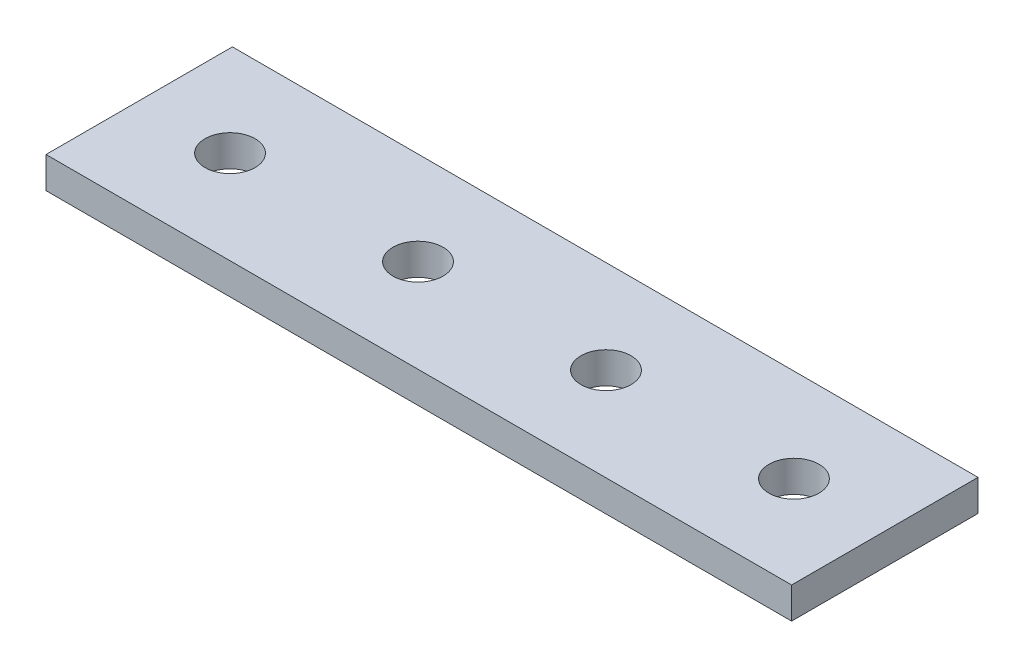
ISO-10303-21;
HEADER;
FILE_DESCRIPTION(('STEP AP214'),'2;1');
FILE_NAME('part.step','',(''),(''),'','','');
FILE_SCHEMA(('AUTOMOTIVE_DESIGN { 1 0 10303 214 1 1 1 1 }'));
ENDSEC;
DATA;
#1=APPLICATION_CONTEXT('core data for automotive mechanical design processes');
#2=APPLICATION_PROTOCOL_DEFINITION('international standard','automotive_design',2000,#1);
#3=PRODUCT_CONTEXT('',#1,'mechanical');
#4=PRODUCT('Part','Part','',(#3));
#5=PRODUCT_RELATED_PRODUCT_CATEGORY('part','',(#4));
#6=PRODUCT_DEFINITION_FORMATION('','',#4);
#7=PRODUCT_DEFINITION_CONTEXT('part definition',#1,'design');
#8=PRODUCT_DEFINITION('design','',#6,#7);
#9=PRODUCT_DEFINITION_SHAPE('','',#8);
#10=(LENGTH_UNIT() NAMED_UNIT(*) SI_UNIT(.MILLI.,.METRE.));
#11=(NAMED_UNIT(*) PLANE_ANGLE_UNIT() SI_UNIT($,.RADIAN.));
#12=(NAMED_UNIT(*) SI_UNIT($,.STERADIAN.) SOLID_ANGLE_UNIT());
#13=UNCERTAINTY_MEASURE_WITH_UNIT(LENGTH_MEASURE(1.E-05),#10,'distance_accuracy_value','');
#14=(GEOMETRIC_REPRESENTATION_CONTEXT(3) GLOBAL_UNCERTAINTY_ASSIGNED_CONTEXT((#13)) GLOBAL_UNIT_ASSIGNED_CONTEXT((#10,
#11,#12)) REPRESENTATION_CONTEXT('',''));
#15=CARTESIAN_POINT('',(0.,0.,0.));
#16=DIRECTION('',(0.,0.,1.));
#17=DIRECTION('',(1.,0.,0.));
#18=AXIS2_PLACEMENT_3D('',#15,#16,#17);
#19=CARTESIAN_POINT('',(47.8,2.,0.));
#20=DIRECTION('',(1.,0.,0.));
#21=DIRECTION('',(0.,0.,-1.));
#22=AXIS2_PLACEMENT_3D('',#19,#20,#21);
#23=PLANE('',#22);
#24=DIRECTION('',(0.,0.,1.));
#25=VECTOR('',#24,1.);
#26=CARTESIAN_POINT('',(47.8,0.,0.));
#27=LINE('',#26,#25);
#28=CARTESIAN_POINT('',(47.8,0.,-11.9));
#29=VERTEX_POINT('',#28);
#30=CARTESIAN_POINT('',(47.8,0.,0.));
#31=VERTEX_POINT('',#30);
#32=EDGE_CURVE('E108',#29,#31,#27,.T.);
#33=ORIENTED_EDGE('',*,*,#32,.F.);
#34=DIRECTION('',(0.,-1.,0.));
#35=VECTOR('',#34,1.);
#36=CARTESIAN_POINT('',(47.8,2.,-11.9));
#37=LINE('',#36,#35);
#38=CARTESIAN_POINT('',(47.8,2.,-11.9));
#39=VERTEX_POINT('',#38);
#40=EDGE_CURVE('E11',#39,#29,#37,.T.);
#41=ORIENTED_EDGE('',*,*,#40,.F.);
#42=DIRECTION('',(0.,0.,1.));
#43=VECTOR('',#42,1.);
#44=CARTESIAN_POINT('',(47.8,2.,0.));
#45=LINE('',#44,#43);
#46=CARTESIAN_POINT('',(47.8,2.,0.));
#47=VERTEX_POINT('',#46);
#48=EDGE_CURVE('E101',#39,#47,#45,.T.);
#49=ORIENTED_EDGE('',*,*,#48,.T.);
#50=DIRECTION('',(0.,-1.,0.));
#51=VECTOR('',#50,1.);
#52=CARTESIAN_POINT('',(47.8,2.,0.));
#53=LINE('',#52,#51);
#54=EDGE_CURVE('E81',#47,#31,#53,.T.);
#55=ORIENTED_EDGE('',*,*,#54,.T.);
#56=EDGE_LOOP('',(#33,#41,#49,#55));
#57=FACE_BOUND('',#56,.T.);
#58=ADVANCED_FACE('F41',(#57),#23,.T.);
#59=CARTESIAN_POINT('',(0.,2.,-11.9));
#60=DIRECTION('',(0.,0.,-1.));
#61=DIRECTION('',(-1.,0.,0.));
#62=AXIS2_PLACEMENT_3D('',#59,#60,#61);
#63=PLANE('',#62);
#64=DIRECTION('',(1.,0.,0.));
#65=VECTOR('',#64,1.);
#66=CARTESIAN_POINT('',(0.,0.,-11.9));
#67=LINE('',#66,#65);
#68=CARTESIAN_POINT('',(0.200000000000001,0.,-11.9));
#69=VERTEX_POINT('',#68);
#70=EDGE_CURVE('E94',#69,#29,#67,.T.);
#71=ORIENTED_EDGE('',*,*,#70,.F.);
#72=DIRECTION('',(0.,-1.,0.));
#73=VECTOR('',#72,1.);
#74=CARTESIAN_POINT('',(0.200000000000001,2.,-11.9));
#75=LINE('',#74,#73);
#76=CARTESIAN_POINT('',(0.200000000000001,2.,-11.9));
#77=VERTEX_POINT('',#76);
#78=EDGE_CURVE('E50',#77,#69,#75,.T.);
#79=ORIENTED_EDGE('',*,*,#78,.F.);
#80=DIRECTION('',(1.,0.,0.));
#81=VECTOR('',#80,1.);
#82=CARTESIAN_POINT('',(0.,2.,-11.9));
#83=LINE('',#82,#81);
#84=EDGE_CURVE('E92',#77,#39,#83,.T.);
#85=ORIENTED_EDGE('',*,*,#84,.T.);
#86=ORIENTED_EDGE('',*,*,#40,.T.);
#87=EDGE_LOOP('',(#71,#79,#85,#86));
#88=FACE_BOUND('',#87,.T.);
#89=ADVANCED_FACE('F90',(#88),#63,.T.);
#90=CARTESIAN_POINT('',(0.200000000000001,2.,0.));
#91=DIRECTION('',(1.,0.,0.));
#92=DIRECTION('',(0.,0.,-1.));
#93=AXIS2_PLACEMENT_3D('',#90,#91,#92);
#94=PLANE('',#93);
#95=DIRECTION('',(0.,0.,1.));
#96=VECTOR('',#95,1.);
#97=CARTESIAN_POINT('',(0.200000000000001,0.,0.));
#98=LINE('',#97,#96);
#99=CARTESIAN_POINT('',(0.200000000000001,0.,0.));
#100=VERTEX_POINT('',#99);
#101=EDGE_CURVE('E74',#69,#100,#98,.T.);
#102=ORIENTED_EDGE('',*,*,#101,.T.);
#103=DIRECTION('',(0.,-1.,0.));
#104=VECTOR('',#103,1.);
#105=CARTESIAN_POINT('',(0.200000000000001,2.,0.));
#106=LINE('',#105,#104);
#107=CARTESIAN_POINT('',(0.200000000000001,2.,0.));
#108=VERTEX_POINT('',#107);
#109=EDGE_CURVE('E95',#108,#100,#106,.T.);
#110=ORIENTED_EDGE('',*,*,#109,.F.);
#111=DIRECTION('',(0.,0.,1.));
#112=VECTOR('',#111,1.);
#113=CARTESIAN_POINT('',(0.200000000000001,2.,0.));
#114=LINE('',#113,#112);
#115=EDGE_CURVE('E97',#77,#108,#114,.T.);
#116=ORIENTED_EDGE('',*,*,#115,.F.);
#117=ORIENTED_EDGE('',*,*,#78,.T.);
#118=EDGE_LOOP('',(#102,#110,#116,#117));
#119=FACE_BOUND('',#118,.T.);
#120=ADVANCED_FACE('F98',(#119),#94,.F.);
#121=CARTESIAN_POINT('',(0.,2.,0.));
#122=DIRECTION('',(0.,0.,-1.));
#123=DIRECTION('',(-1.,0.,0.));
#124=AXIS2_PLACEMENT_3D('',#121,#122,#123);
#125=PLANE('',#124);
#126=DIRECTION('',(1.,0.,0.));
#127=VECTOR('',#126,1.);
#128=CARTESIAN_POINT('',(0.,0.,0.));
#129=LINE('',#128,#127);
#130=EDGE_CURVE('E103',#100,#31,#129,.T.);
#131=ORIENTED_EDGE('',*,*,#130,.T.);
#132=ORIENTED_EDGE('',*,*,#54,.F.);
#133=DIRECTION('',(1.,0.,0.));
#134=VECTOR('',#133,1.);
#135=CARTESIAN_POINT('',(0.,2.,0.));
#136=LINE('',#135,#134);
#137=EDGE_CURVE('E59',#108,#47,#136,.T.);
#138=ORIENTED_EDGE('',*,*,#137,.F.);
#139=ORIENTED_EDGE('',*,*,#109,.T.);
#140=EDGE_LOOP('',(#131,#132,#138,#139));
#141=FACE_BOUND('',#140,.T.);
#142=ADVANCED_FACE('F164',(#141),#125,.F.);
#143=CARTESIAN_POINT('',(0.,2.,0.));
#144=DIRECTION('',(0.,1.,0.));
#145=DIRECTION('',(0.,0.,1.));
#146=AXIS2_PLACEMENT_3D('',#143,#144,#145);
#147=PLANE('',#146);
#148=CARTESIAN_POINT('',(42.,2.,-5.95));
#149=DIRECTION('',(0.,1.,0.));
#150=DIRECTION('',(0.,0.,1.));
#151=AXIS2_PLACEMENT_3D('',#148,#149,#150);
#152=CIRCLE('',#151,1.6);
#153=CARTESIAN_POINT('',(42.,2.,-4.35));
#154=VERTEX_POINT('',#153);
#155=EDGE_CURVE('E133',#154,#154,#152,.T.);
#156=ORIENTED_EDGE('',*,*,#155,.F.);
#157=EDGE_LOOP('',(#156));
#158=FACE_BOUND('',#157,.T.);
#159=CARTESIAN_POINT('',(30.,2.,-5.95));
#160=DIRECTION('',(0.,1.,0.));
#161=DIRECTION('',(0.,0.,1.));
#162=AXIS2_PLACEMENT_3D('',#159,#160,#161);
#163=CIRCLE('',#162,1.6);
#164=CARTESIAN_POINT('',(30.,2.,-4.35));
#165=VERTEX_POINT('',#164);
#166=EDGE_CURVE('E123',#165,#165,#163,.T.);
#167=ORIENTED_EDGE('',*,*,#166,.F.);
#168=EDGE_LOOP('',(#167));
#169=FACE_BOUND('',#168,.T.);
#170=CARTESIAN_POINT('',(18.,2.,-5.95));
#171=DIRECTION('',(0.,1.,0.));
#172=DIRECTION('',(0.,0.,1.));
#173=AXIS2_PLACEMENT_3D('',#170,#171,#172);
#174=CIRCLE('',#173,1.6);
#175=CARTESIAN_POINT('',(18.,2.,-4.35));
#176=VERTEX_POINT('',#175);
#177=EDGE_CURVE('E120',#176,#176,#174,.T.);
#178=ORIENTED_EDGE('',*,*,#177,.F.);
#179=EDGE_LOOP('',(#178));
#180=FACE_BOUND('',#179,.T.);
#181=CARTESIAN_POINT('',(6.,2.,-5.95));
#182=DIRECTION('',(0.,1.,0.));
#183=DIRECTION('',(0.,0.,1.));
#184=AXIS2_PLACEMENT_3D('',#181,#182,#183);
#185=CIRCLE('',#184,1.6);
#186=CARTESIAN_POINT('',(6.,2.,-4.35));
#187=VERTEX_POINT('',#186);
#188=EDGE_CURVE('E119',#187,#187,#185,.T.);
#189=ORIENTED_EDGE('',*,*,#188,.F.);
#190=EDGE_LOOP('',(#189));
#191=FACE_BOUND('',#190,.T.);
#192=ORIENTED_EDGE('',*,*,#48,.F.);
#193=ORIENTED_EDGE('',*,*,#84,.F.);
#194=ORIENTED_EDGE('',*,*,#115,.T.);
#195=ORIENTED_EDGE('',*,*,#137,.T.);
#196=EDGE_LOOP('',(#192,#193,#194,#195));
#197=FACE_BOUND('',#196,.T.);
#198=ADVANCED_FACE('F100',(#158,#169,#180,#191,#197),#147,.T.);
#199=CARTESIAN_POINT('',(0.,0.,0.));
#200=DIRECTION('',(0.,1.,0.));
#201=DIRECTION('',(0.,0.,1.));
#202=AXIS2_PLACEMENT_3D('',#199,#200,#201);
#203=PLANE('',#202);
#204=CARTESIAN_POINT('',(42.,0.,-5.95));
#205=DIRECTION('',(0.,1.,0.));
#206=DIRECTION('',(0.,0.,1.));
#207=AXIS2_PLACEMENT_3D('',#204,#205,#206);
#208=CIRCLE('',#207,1.6);
#209=CARTESIAN_POINT('',(42.,0.,-4.35));
#210=VERTEX_POINT('',#209);
#211=EDGE_CURVE('E44',#210,#210,#208,.T.);
#212=ORIENTED_EDGE('',*,*,#211,.T.);
#213=EDGE_LOOP('',(#212));
#214=FACE_BOUND('',#213,.T.);
#215=CARTESIAN_POINT('',(30.,0.,-5.95));
#216=DIRECTION('',(0.,1.,0.));
#217=DIRECTION('',(0.,0.,1.));
#218=AXIS2_PLACEMENT_3D('',#215,#216,#217);
#219=CIRCLE('',#218,1.6);
#220=CARTESIAN_POINT('',(30.,0.,-4.35));
#221=VERTEX_POINT('',#220);
#222=EDGE_CURVE('E121',#221,#221,#219,.T.);
#223=ORIENTED_EDGE('',*,*,#222,.T.);
#224=EDGE_LOOP('',(#223));
#225=FACE_BOUND('',#224,.T.);
#226=CARTESIAN_POINT('',(18.,0.,-5.95));
#227=DIRECTION('',(0.,1.,0.));
#228=DIRECTION('',(0.,0.,1.));
#229=AXIS2_PLACEMENT_3D('',#226,#227,#228);
#230=CIRCLE('',#229,1.6);
#231=CARTESIAN_POINT('',(18.,0.,-4.35));
#232=VERTEX_POINT('',#231);
#233=EDGE_CURVE('E117',#232,#232,#230,.T.);
#234=ORIENTED_EDGE('',*,*,#233,.T.);
#235=EDGE_LOOP('',(#234));
#236=FACE_BOUND('',#235,.T.);
#237=CARTESIAN_POINT('',(6.,0.,-5.95));
#238=DIRECTION('',(0.,1.,0.));
#239=DIRECTION('',(0.,0.,1.));
#240=AXIS2_PLACEMENT_3D('',#237,#238,#239);
#241=CIRCLE('',#240,1.6);
#242=CARTESIAN_POINT('',(6.,0.,-4.35));
#243=VERTEX_POINT('',#242);
#244=EDGE_CURVE('E111',#243,#243,#241,.T.);
#245=ORIENTED_EDGE('',*,*,#244,.T.);
#246=EDGE_LOOP('',(#245));
#247=FACE_BOUND('',#246,.T.);
#248=ORIENTED_EDGE('',*,*,#32,.T.);
#249=ORIENTED_EDGE('',*,*,#130,.F.);
#250=ORIENTED_EDGE('',*,*,#101,.F.);
#251=ORIENTED_EDGE('',*,*,#70,.T.);
#252=EDGE_LOOP('',(#248,#249,#250,#251));
#253=FACE_BOUND('',#252,.T.);
#254=ADVANCED_FACE('F140',(#214,#225,#236,#247,#253),#203,.F.);
#255=CARTESIAN_POINT('',(6.,2.,-5.95));
#256=DIRECTION('',(0.,1.,0.));
#257=DIRECTION('',(0.,0.,1.));
#258=AXIS2_PLACEMENT_3D('',#255,#256,#257);
#259=CYLINDRICAL_SURFACE('',#258,1.6);
#260=ORIENTED_EDGE('',*,*,#188,.T.);
#261=EDGE_LOOP('',(#260));
#262=FACE_BOUND('',#261,.T.);
#263=ORIENTED_EDGE('',*,*,#244,.F.);
#264=EDGE_LOOP('',(#263));
#265=FACE_BOUND('',#264,.T.);
#266=ADVANCED_FACE('F143',(#262,#265),#259,.F.);
#267=CARTESIAN_POINT('',(18.,2.,-5.95));
#268=DIRECTION('',(0.,1.,0.));
#269=DIRECTION('',(0.,0.,1.));
#270=AXIS2_PLACEMENT_3D('',#267,#268,#269);
#271=CYLINDRICAL_SURFACE('',#270,1.6);
#272=ORIENTED_EDGE('',*,*,#177,.T.);
#273=EDGE_LOOP('',(#272));
#274=FACE_BOUND('',#273,.T.);
#275=ORIENTED_EDGE('',*,*,#233,.F.);
#276=EDGE_LOOP('',(#275));
#277=FACE_BOUND('',#276,.T.);
#278=ADVANCED_FACE('F145',(#274,#277),#271,.F.);
#279=CARTESIAN_POINT('',(30.,2.,-5.95));
#280=DIRECTION('',(0.,1.,0.));
#281=DIRECTION('',(0.,0.,1.));
#282=AXIS2_PLACEMENT_3D('',#279,#280,#281);
#283=CYLINDRICAL_SURFACE('',#282,1.6);
#284=ORIENTED_EDGE('',*,*,#166,.T.);
#285=EDGE_LOOP('',(#284));
#286=FACE_BOUND('',#285,.T.);
#287=ORIENTED_EDGE('',*,*,#222,.F.);
#288=EDGE_LOOP('',(#287));
#289=FACE_BOUND('',#288,.T.);
#290=ADVANCED_FACE('F152',(#286,#289),#283,.F.);
#291=CARTESIAN_POINT('',(42.,2.,-5.95));
#292=DIRECTION('',(0.,1.,0.));
#293=DIRECTION('',(0.,0.,1.));
#294=AXIS2_PLACEMENT_3D('',#291,#292,#293);
#295=CYLINDRICAL_SURFACE('',#294,1.6);
#296=ORIENTED_EDGE('',*,*,#155,.T.);
#297=EDGE_LOOP('',(#296));
#298=FACE_BOUND('',#297,.T.);
#299=ORIENTED_EDGE('',*,*,#211,.F.);
#300=EDGE_LOOP('',(#299));
#301=FACE_BOUND('',#300,.T.);
#302=ADVANCED_FACE('F219',(#298,#301),#295,.F.);
#303=CLOSED_SHELL('',(#58,#89,#120,#142,#198,#254,#266,#278,#290,#302));
#304=MANIFOLD_SOLID_BREP('B2',#303);
#305=ADVANCED_BREP_SHAPE_REPRESENTATION('',(#18,#304),#14);
#306=SHAPE_DEFINITION_REPRESENTATION(#9,#305);
ENDSEC;
END-ISO-10303-21;
